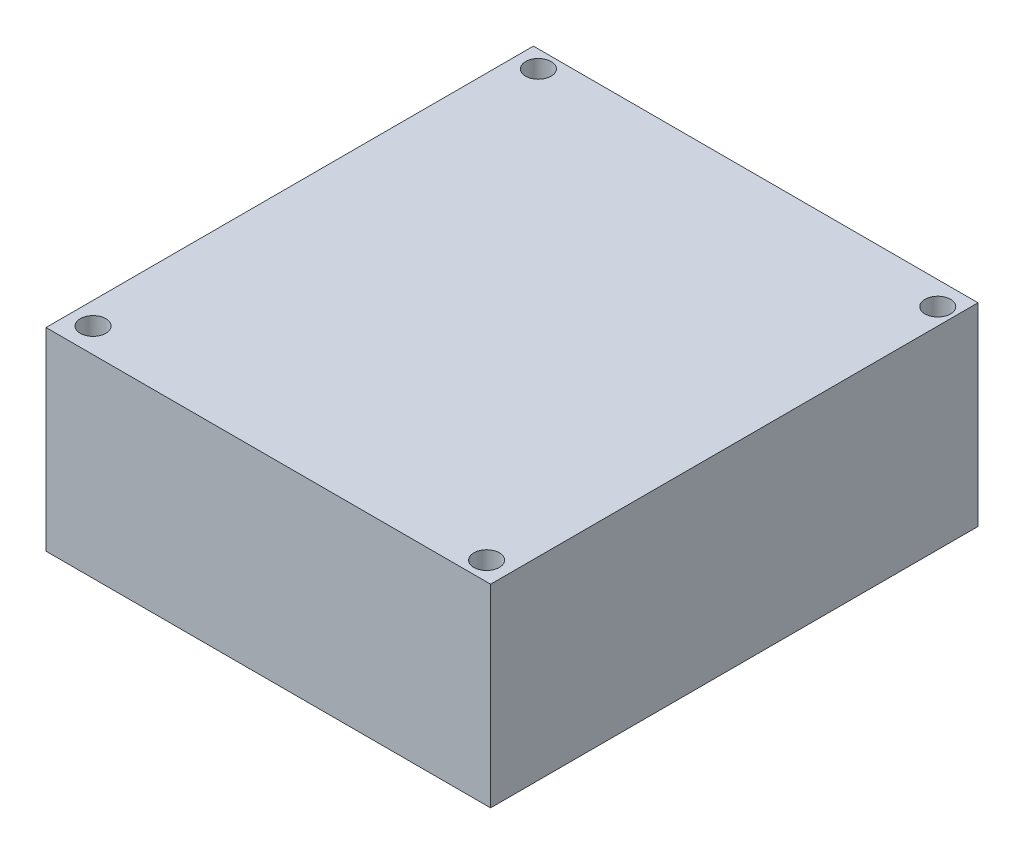
ISO-10303-21;
HEADER;
FILE_DESCRIPTION(('STEP AP214'),'2;1');
FILE_NAME('part.step','',(''),(''),'','','');
FILE_SCHEMA(('AUTOMOTIVE_DESIGN { 1 0 10303 214 1 1 1 1 }'));
ENDSEC;
DATA;
#1=APPLICATION_CONTEXT('core data for automotive mechanical design processes');
#2=APPLICATION_PROTOCOL_DEFINITION('international standard','automotive_design',2000,#1);
#3=PRODUCT_CONTEXT('',#1,'mechanical');
#4=PRODUCT('Part','Part','',(#3));
#5=PRODUCT_RELATED_PRODUCT_CATEGORY('part','',(#4));
#6=PRODUCT_DEFINITION_FORMATION('','',#4);
#7=PRODUCT_DEFINITION_CONTEXT('part definition',#1,'design');
#8=PRODUCT_DEFINITION('design','',#6,#7);
#9=PRODUCT_DEFINITION_SHAPE('','',#8);
#10=(LENGTH_UNIT() NAMED_UNIT(*) SI_UNIT(.MILLI.,.METRE.));
#11=(NAMED_UNIT(*) PLANE_ANGLE_UNIT() SI_UNIT($,.RADIAN.));
#12=(NAMED_UNIT(*) SI_UNIT($,.STERADIAN.) SOLID_ANGLE_UNIT());
#13=UNCERTAINTY_MEASURE_WITH_UNIT(LENGTH_MEASURE(1.E-05),#10,'distance_accuracy_value','');
#14=(GEOMETRIC_REPRESENTATION_CONTEXT(3) GLOBAL_UNCERTAINTY_ASSIGNED_CONTEXT((#13)) GLOBAL_UNIT_ASSIGNED_CONTEXT((#10,
#11,#12)) REPRESENTATION_CONTEXT('',''));
#15=CARTESIAN_POINT('',(0.,0.,0.));
#16=DIRECTION('',(0.,0.,1.));
#17=DIRECTION('',(1.,0.,0.));
#18=AXIS2_PLACEMENT_3D('',#15,#16,#17);
#19=CARTESIAN_POINT('',(0.,19.,0.));
#20=DIRECTION('',(1.,0.,0.));
#21=DIRECTION('',(0.,0.,-1.));
#22=AXIS2_PLACEMENT_3D('',#19,#20,#21);
#23=PLANE('',#22);
#24=DIRECTION('',(0.,0.,1.));
#25=VECTOR('',#24,1.);
#26=CARTESIAN_POINT('',(0.,0.,0.));
#27=LINE('',#26,#25);
#28=CARTESIAN_POINT('',(0.,0.,-47.8));
#29=VERTEX_POINT('',#28);
#30=CARTESIAN_POINT('',(0.,0.,0.));
#31=VERTEX_POINT('',#30);
#32=EDGE_CURVE('E97',#29,#31,#27,.T.);
#33=ORIENTED_EDGE('',*,*,#32,.T.);
#34=DIRECTION('',(0.,-1.,0.));
#35=VECTOR('',#34,1.);
#36=CARTESIAN_POINT('',(0.,19.,0.));
#37=LINE('',#36,#35);
#38=CARTESIAN_POINT('',(0.,19.,0.));
#39=VERTEX_POINT('',#38);
#40=EDGE_CURVE('E11',#39,#31,#37,.T.);
#41=ORIENTED_EDGE('',*,*,#40,.F.);
#42=DIRECTION('',(0.,0.,1.));
#43=VECTOR('',#42,1.);
#44=CARTESIAN_POINT('',(0.,19.,0.));
#45=LINE('',#44,#43);
#46=CARTESIAN_POINT('',(0.,19.,-47.8));
#47=VERTEX_POINT('',#46);
#48=EDGE_CURVE('E85',#47,#39,#45,.T.);
#49=ORIENTED_EDGE('',*,*,#48,.F.);
#50=DIRECTION('',(0.,-1.,0.));
#51=VECTOR('',#50,1.);
#52=CARTESIAN_POINT('',(0.,19.,-47.8));
#53=LINE('',#52,#51);
#54=EDGE_CURVE('E93',#47,#29,#53,.T.);
#55=ORIENTED_EDGE('',*,*,#54,.T.);
#56=EDGE_LOOP('',(#33,#41,#49,#55));
#57=FACE_BOUND('',#56,.T.);
#58=ADVANCED_FACE('F34',(#57),#23,.F.);
#59=CARTESIAN_POINT('',(0.,19.,0.));
#60=DIRECTION('',(0.,0.,-1.));
#61=DIRECTION('',(-1.,0.,0.));
#62=AXIS2_PLACEMENT_3D('',#59,#60,#61);
#63=PLANE('',#62);
#64=DIRECTION('',(1.,0.,0.));
#65=VECTOR('',#64,1.);
#66=CARTESIAN_POINT('',(0.,0.,0.));
#67=LINE('',#66,#65);
#68=CARTESIAN_POINT('',(43.6,0.,0.));
#69=VERTEX_POINT('',#68);
#70=EDGE_CURVE('E89',#31,#69,#67,.T.);
#71=ORIENTED_EDGE('',*,*,#70,.T.);
#72=DIRECTION('',(0.,-1.,0.));
#73=VECTOR('',#72,1.);
#74=CARTESIAN_POINT('',(43.6,19.,0.));
#75=LINE('',#74,#73);
#76=CARTESIAN_POINT('',(43.6,19.,0.));
#77=VERTEX_POINT('',#76);
#78=EDGE_CURVE('E42',#77,#69,#75,.T.);
#79=ORIENTED_EDGE('',*,*,#78,.F.);
#80=DIRECTION('',(1.,0.,0.));
#81=VECTOR('',#80,1.);
#82=CARTESIAN_POINT('',(0.,19.,0.));
#83=LINE('',#82,#81);
#84=EDGE_CURVE('E80',#39,#77,#83,.T.);
#85=ORIENTED_EDGE('',*,*,#84,.F.);
#86=ORIENTED_EDGE('',*,*,#40,.T.);
#87=EDGE_LOOP('',(#71,#79,#85,#86));
#88=FACE_BOUND('',#87,.T.);
#89=ADVANCED_FACE('F88',(#88),#63,.F.);
#90=CARTESIAN_POINT('',(43.6,19.,0.));
#91=DIRECTION('',(-1.,0.,0.));
#92=DIRECTION('',(0.,0.,1.));
#93=AXIS2_PLACEMENT_3D('',#90,#91,#92);
#94=PLANE('',#93);
#95=DIRECTION('',(0.,0.,-1.));
#96=VECTOR('',#95,1.);
#97=CARTESIAN_POINT('',(43.6,0.,0.));
#98=LINE('',#97,#96);
#99=CARTESIAN_POINT('',(43.6,0.,-47.8));
#100=VERTEX_POINT('',#99);
#101=EDGE_CURVE('E67',#69,#100,#98,.T.);
#102=ORIENTED_EDGE('',*,*,#101,.T.);
#103=DIRECTION('',(0.,-1.,0.));
#104=VECTOR('',#103,1.);
#105=CARTESIAN_POINT('',(43.6,19.,-47.8));
#106=LINE('',#105,#104);
#107=CARTESIAN_POINT('',(43.6,19.,-47.8));
#108=VERTEX_POINT('',#107);
#109=EDGE_CURVE('E90',#108,#100,#106,.T.);
#110=ORIENTED_EDGE('',*,*,#109,.F.);
#111=DIRECTION('',(0.,0.,-1.));
#112=VECTOR('',#111,1.);
#113=CARTESIAN_POINT('',(43.6,19.,0.));
#114=LINE('',#113,#112);
#115=EDGE_CURVE('E83',#77,#108,#114,.T.);
#116=ORIENTED_EDGE('',*,*,#115,.F.);
#117=ORIENTED_EDGE('',*,*,#78,.T.);
#118=EDGE_LOOP('',(#102,#110,#116,#117));
#119=FACE_BOUND('',#118,.T.);
#120=ADVANCED_FACE('F91',(#119),#94,.F.);
#121=CARTESIAN_POINT('',(0.,19.,-47.8));
#122=DIRECTION('',(0.,0.,1.));
#123=DIRECTION('',(1.,0.,0.));
#124=AXIS2_PLACEMENT_3D('',#121,#122,#123);
#125=PLANE('',#124);
#126=DIRECTION('',(-1.,0.,0.));
#127=VECTOR('',#126,1.);
#128=CARTESIAN_POINT('',(0.,0.,-47.8));
#129=LINE('',#128,#127);
#130=EDGE_CURVE('E73',#100,#29,#129,.T.);
#131=ORIENTED_EDGE('',*,*,#130,.T.);
#132=ORIENTED_EDGE('',*,*,#54,.F.);
#133=DIRECTION('',(-1.,0.,0.));
#134=VECTOR('',#133,1.);
#135=CARTESIAN_POINT('',(0.,19.,-47.8));
#136=LINE('',#135,#134);
#137=EDGE_CURVE('E50',#108,#47,#136,.T.);
#138=ORIENTED_EDGE('',*,*,#137,.F.);
#139=ORIENTED_EDGE('',*,*,#109,.T.);
#140=EDGE_LOOP('',(#131,#132,#138,#139));
#141=FACE_BOUND('',#140,.T.);
#142=ADVANCED_FACE('F105',(#141),#125,.F.);
#143=CARTESIAN_POINT('',(0.,19.,0.));
#144=DIRECTION('',(0.,-1.,0.));
#145=DIRECTION('',(0.,0.,-1.));
#146=AXIS2_PLACEMENT_3D('',#143,#144,#145);
#147=PLANE('',#146);
#148=CARTESIAN_POINT('',(2.1776455758305,19.,-2.43587036180617));
#149=DIRECTION('',(0.,1.,0.));
#150=DIRECTION('',(0.,0.,1.));
#151=AXIS2_PLACEMENT_3D('',#148,#149,#150);
#152=CIRCLE('',#151,1.25);
#153=CARTESIAN_POINT('',(2.1776455758305,19.,-1.18587036180617));
#154=VERTEX_POINT('',#153);
#155=EDGE_CURVE('E129',#154,#154,#152,.T.);
#156=ORIENTED_EDGE('',*,*,#155,.F.);
#157=EDGE_LOOP('',(#156));
#158=FACE_BOUND('',#157,.T.);
#159=CARTESIAN_POINT('',(41.3610709625384,19.,-1.84844667378779));
#160=DIRECTION('',(0.,1.,0.));
#161=DIRECTION('',(0.,0.,1.));
#162=AXIS2_PLACEMENT_3D('',#159,#160,#161);
#163=CIRCLE('',#162,1.25);
#164=CARTESIAN_POINT('',(41.3610709625384,19.,-0.598446673787792));
#165=VERTEX_POINT('',#164);
#166=EDGE_CURVE('E123',#165,#165,#163,.T.);
#167=ORIENTED_EDGE('',*,*,#166,.F.);
#168=EDGE_LOOP('',(#167));
#169=FACE_BOUND('',#168,.T.);
#170=CARTESIAN_POINT('',(41.9521887183622,19.,-45.5020220407909));
#171=DIRECTION('',(0.,1.,0.));
#172=DIRECTION('',(0.,0.,1.));
#173=AXIS2_PLACEMENT_3D('',#170,#171,#172);
#174=CIRCLE('',#173,1.25);
#175=CARTESIAN_POINT('',(41.9521887183622,19.,-44.2520220407909));
#176=VERTEX_POINT('',#175);
#177=EDGE_CURVE('E117',#176,#176,#174,.T.);
#178=ORIENTED_EDGE('',*,*,#177,.F.);
#179=EDGE_LOOP('',(#178));
#180=FACE_BOUND('',#179,.T.);
#181=CARTESIAN_POINT('',(2.1776455758305,19.,-46.1111347458479));
#182=DIRECTION('',(0.,1.,0.));
#183=DIRECTION('',(0.,0.,1.));
#184=AXIS2_PLACEMENT_3D('',#181,#182,#183);
#185=CIRCLE('',#184,1.25);
#186=CARTESIAN_POINT('',(2.1776455758305,19.,-44.8611347458479));
#187=VERTEX_POINT('',#186);
#188=EDGE_CURVE('E111',#187,#187,#185,.T.);
#189=ORIENTED_EDGE('',*,*,#188,.F.);
#190=EDGE_LOOP('',(#189));
#191=FACE_BOUND('',#190,.T.);
#192=ORIENTED_EDGE('',*,*,#48,.T.);
#193=ORIENTED_EDGE('',*,*,#84,.T.);
#194=ORIENTED_EDGE('',*,*,#115,.T.);
#195=ORIENTED_EDGE('',*,*,#137,.T.);
#196=EDGE_LOOP('',(#192,#193,#194,#195));
#197=FACE_BOUND('',#196,.T.);
#198=ADVANCED_FACE('F81',(#158,#169,#180,#191,#197),#147,.F.);
#199=CARTESIAN_POINT('',(0.,0.,0.));
#200=DIRECTION('',(0.,-1.,0.));
#201=DIRECTION('',(0.,0.,-1.));
#202=AXIS2_PLACEMENT_3D('',#199,#200,#201);
#203=PLANE('',#202);
#204=CARTESIAN_POINT('',(2.1776455758305,0.,-2.43587036180617));
#205=DIRECTION('',(0.,1.,0.));
#206=DIRECTION('',(0.,0.,1.));
#207=AXIS2_PLACEMENT_3D('',#204,#205,#206);
#208=CIRCLE('',#207,1.25);
#209=CARTESIAN_POINT('',(2.1776455758305,0.,-1.18587036180617));
#210=VERTEX_POINT('',#209);
#211=EDGE_CURVE('E126',#210,#210,#208,.T.);
#212=ORIENTED_EDGE('',*,*,#211,.T.);
#213=EDGE_LOOP('',(#212));
#214=FACE_BOUND('',#213,.T.);
#215=CARTESIAN_POINT('',(41.3610709625384,0.,-1.84844667378779));
#216=DIRECTION('',(0.,1.,0.));
#217=DIRECTION('',(0.,0.,1.));
#218=AXIS2_PLACEMENT_3D('',#215,#216,#217);
#219=CIRCLE('',#218,1.25);
#220=CARTESIAN_POINT('',(41.3610709625384,0.,-0.598446673787792));
#221=VERTEX_POINT('',#220);
#222=EDGE_CURVE('E120',#221,#221,#219,.T.);
#223=ORIENTED_EDGE('',*,*,#222,.T.);
#224=EDGE_LOOP('',(#223));
#225=FACE_BOUND('',#224,.T.);
#226=CARTESIAN_POINT('',(41.9521887183622,0.,-45.5020220407909));
#227=DIRECTION('',(0.,1.,0.));
#228=DIRECTION('',(0.,0.,1.));
#229=AXIS2_PLACEMENT_3D('',#226,#227,#228);
#230=CIRCLE('',#229,1.25);
#231=CARTESIAN_POINT('',(41.9521887183622,0.,-44.2520220407909));
#232=VERTEX_POINT('',#231);
#233=EDGE_CURVE('E114',#232,#232,#230,.T.);
#234=ORIENTED_EDGE('',*,*,#233,.T.);
#235=EDGE_LOOP('',(#234));
#236=FACE_BOUND('',#235,.T.);
#237=CARTESIAN_POINT('',(2.1776455758305,0.,-46.1111347458479));
#238=DIRECTION('',(0.,1.,0.));
#239=DIRECTION('',(0.,0.,1.));
#240=AXIS2_PLACEMENT_3D('',#237,#238,#239);
#241=CIRCLE('',#240,1.25);
#242=CARTESIAN_POINT('',(2.1776455758305,0.,-44.8611347458479));
#243=VERTEX_POINT('',#242);
#244=EDGE_CURVE('E100',#243,#243,#241,.T.);
#245=ORIENTED_EDGE('',*,*,#244,.T.);
#246=EDGE_LOOP('',(#245));
#247=FACE_BOUND('',#246,.T.);
#248=ORIENTED_EDGE('',*,*,#32,.F.);
#249=ORIENTED_EDGE('',*,*,#130,.F.);
#250=ORIENTED_EDGE('',*,*,#101,.F.);
#251=ORIENTED_EDGE('',*,*,#70,.F.);
#252=EDGE_LOOP('',(#248,#249,#250,#251));
#253=FACE_BOUND('',#252,.T.);
#254=ADVANCED_FACE('F108',(#214,#225,#236,#247,#253),#203,.T.);
#255=CARTESIAN_POINT('',(2.1776455758305,0.,-46.1111347458479));
#256=DIRECTION('',(0.,1.,0.));
#257=DIRECTION('',(0.,0.,1.));
#258=AXIS2_PLACEMENT_3D('',#255,#256,#257);
#259=CYLINDRICAL_SURFACE('',#258,1.25);
#260=ORIENTED_EDGE('',*,*,#244,.F.);
#261=EDGE_LOOP('',(#260));
#262=FACE_BOUND('',#261,.T.);
#263=ORIENTED_EDGE('',*,*,#188,.T.);
#264=EDGE_LOOP('',(#263));
#265=FACE_BOUND('',#264,.T.);
#266=ADVANCED_FACE('F153',(#262,#265),#259,.F.);
#267=CARTESIAN_POINT('',(41.9521887183622,0.,-45.5020220407909));
#268=DIRECTION('',(0.,1.,0.));
#269=DIRECTION('',(0.,0.,1.));
#270=AXIS2_PLACEMENT_3D('',#267,#268,#269);
#271=CYLINDRICAL_SURFACE('',#270,1.25);
#272=ORIENTED_EDGE('',*,*,#233,.F.);
#273=EDGE_LOOP('',(#272));
#274=FACE_BOUND('',#273,.T.);
#275=ORIENTED_EDGE('',*,*,#177,.T.);
#276=EDGE_LOOP('',(#275));
#277=FACE_BOUND('',#276,.T.);
#278=ADVANCED_FACE('F155',(#274,#277),#271,.F.);
#279=CARTESIAN_POINT('',(41.3610709625384,0.,-1.84844667378779));
#280=DIRECTION('',(0.,1.,0.));
#281=DIRECTION('',(0.,0.,1.));
#282=AXIS2_PLACEMENT_3D('',#279,#280,#281);
#283=CYLINDRICAL_SURFACE('',#282,1.25);
#284=ORIENTED_EDGE('',*,*,#222,.F.);
#285=EDGE_LOOP('',(#284));
#286=FACE_BOUND('',#285,.T.);
#287=ORIENTED_EDGE('',*,*,#166,.T.);
#288=EDGE_LOOP('',(#287));
#289=FACE_BOUND('',#288,.T.);
#290=ADVANCED_FACE('F140',(#286,#289),#283,.F.);
#291=CARTESIAN_POINT('',(2.1776455758305,0.,-2.43587036180617));
#292=DIRECTION('',(0.,1.,0.));
#293=DIRECTION('',(0.,0.,1.));
#294=AXIS2_PLACEMENT_3D('',#291,#292,#293);
#295=CYLINDRICAL_SURFACE('',#294,1.25);
#296=ORIENTED_EDGE('',*,*,#211,.F.);
#297=EDGE_LOOP('',(#296));
#298=FACE_BOUND('',#297,.T.);
#299=ORIENTED_EDGE('',*,*,#155,.T.);
#300=EDGE_LOOP('',(#299));
#301=FACE_BOUND('',#300,.T.);
#302=ADVANCED_FACE('F137',(#298,#301),#295,.F.);
#303=CLOSED_SHELL('',(#58,#89,#120,#142,#198,#254,#266,#278,#290,#302));
#304=MANIFOLD_SOLID_BREP('B2',#303);
#305=ADVANCED_BREP_SHAPE_REPRESENTATION('',(#18,#304),#14);
#306=SHAPE_DEFINITION_REPRESENTATION(#9,#305);
ENDSEC;
END-ISO-10303-21;
